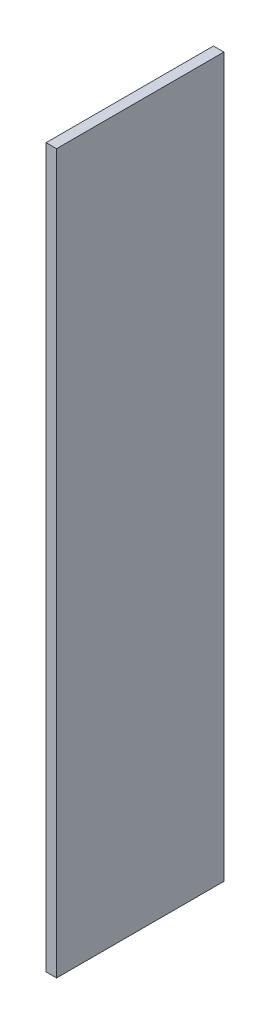
ISO-10303-21;
HEADER;
FILE_DESCRIPTION(('STEP AP214'),'2;1');
FILE_NAME('part.step','',(''),(''),'','','');
FILE_SCHEMA(('AUTOMOTIVE_DESIGN { 1 0 10303 214 1 1 1 1 }'));
ENDSEC;
DATA;
#1=APPLICATION_CONTEXT('core data for automotive mechanical design processes');
#2=APPLICATION_PROTOCOL_DEFINITION('international standard','automotive_design',2000,#1);
#3=PRODUCT_CONTEXT('',#1,'mechanical');
#4=PRODUCT('Part','Part','',(#3));
#5=PRODUCT_RELATED_PRODUCT_CATEGORY('part','',(#4));
#6=PRODUCT_DEFINITION_FORMATION('','',#4);
#7=PRODUCT_DEFINITION_CONTEXT('part definition',#1,'design');
#8=PRODUCT_DEFINITION('design','',#6,#7);
#9=PRODUCT_DEFINITION_SHAPE('','',#8);
#10=(LENGTH_UNIT() NAMED_UNIT(*) SI_UNIT(.MILLI.,.METRE.));
#11=(NAMED_UNIT(*) PLANE_ANGLE_UNIT() SI_UNIT($,.RADIAN.));
#12=(NAMED_UNIT(*) SI_UNIT($,.STERADIAN.) SOLID_ANGLE_UNIT());
#13=UNCERTAINTY_MEASURE_WITH_UNIT(LENGTH_MEASURE(1.E-05),#10,'distance_accuracy_value','');
#14=(GEOMETRIC_REPRESENTATION_CONTEXT(3) GLOBAL_UNCERTAINTY_ASSIGNED_CONTEXT((#13)) GLOBAL_UNIT_ASSIGNED_CONTEXT((#10,
#11,#12)) REPRESENTATION_CONTEXT('',''));
#15=CARTESIAN_POINT('',(0.,0.,0.));
#16=DIRECTION('',(0.,0.,1.));
#17=DIRECTION('',(1.,0.,0.));
#18=AXIS2_PLACEMENT_3D('',#15,#16,#17);
#19=CARTESIAN_POINT('',(3.,-103.,-24.));
#20=DIRECTION('',(0.,0.,1.));
#21=DIRECTION('',(1.,0.,0.));
#22=AXIS2_PLACEMENT_3D('',#19,#20,#21);
#23=PLANE('',#22);
#24=DIRECTION('',(0.,1.,0.));
#25=VECTOR('',#24,1.);
#26=CARTESIAN_POINT('',(0.,-103.,-24.));
#27=LINE('',#26,#25);
#28=CARTESIAN_POINT('',(0.,-103.,-24.));
#29=VERTEX_POINT('',#28);
#30=CARTESIAN_POINT('',(0.,103.,-24.));
#31=VERTEX_POINT('',#30);
#32=EDGE_CURVE('E107',#29,#31,#27,.T.);
#33=ORIENTED_EDGE('',*,*,#32,.T.);
#34=DIRECTION('',(-1.,0.,0.));
#35=VECTOR('',#34,1.);
#36=CARTESIAN_POINT('',(3.,103.,-24.));
#37=LINE('',#36,#35);
#38=CARTESIAN_POINT('',(3.,103.,-24.));
#39=VERTEX_POINT('',#38);
#40=EDGE_CURVE('E11',#39,#31,#37,.T.);
#41=ORIENTED_EDGE('',*,*,#40,.F.);
#42=DIRECTION('',(0.,1.,0.));
#43=VECTOR('',#42,1.);
#44=CARTESIAN_POINT('',(3.,-103.,-24.));
#45=LINE('',#44,#43);
#46=CARTESIAN_POINT('',(3.,-103.,-24.));
#47=VERTEX_POINT('',#46);
#48=EDGE_CURVE('E91',#47,#39,#45,.T.);
#49=ORIENTED_EDGE('',*,*,#48,.F.);
#50=DIRECTION('',(-1.,0.,0.));
#51=VECTOR('',#50,1.);
#52=CARTESIAN_POINT('',(3.,-103.,-24.));
#53=LINE('',#52,#51);
#54=EDGE_CURVE('E103',#47,#29,#53,.T.);
#55=ORIENTED_EDGE('',*,*,#54,.T.);
#56=EDGE_LOOP('',(#33,#41,#49,#55));
#57=FACE_BOUND('',#56,.T.);
#58=ADVANCED_FACE('F39',(#57),#23,.F.);
#59=CARTESIAN_POINT('',(3.,103.,24.));
#60=DIRECTION('',(0.,-1.,0.));
#61=DIRECTION('',(0.,0.,-1.));
#62=AXIS2_PLACEMENT_3D('',#59,#60,#61);
#63=PLANE('',#62);
#64=DIRECTION('',(0.,0.,1.));
#65=VECTOR('',#64,1.);
#66=CARTESIAN_POINT('',(0.,103.,24.));
#67=LINE('',#66,#65);
#68=CARTESIAN_POINT('',(0.,103.,24.));
#69=VERTEX_POINT('',#68);
#70=EDGE_CURVE('E96',#31,#69,#67,.T.);
#71=ORIENTED_EDGE('',*,*,#70,.T.);
#72=DIRECTION('',(-1.,0.,0.));
#73=VECTOR('',#72,1.);
#74=CARTESIAN_POINT('',(3.,103.,24.));
#75=LINE('',#74,#73);
#76=CARTESIAN_POINT('',(3.,103.,24.));
#77=VERTEX_POINT('',#76);
#78=EDGE_CURVE('E48',#77,#69,#75,.T.);
#79=ORIENTED_EDGE('',*,*,#78,.F.);
#80=DIRECTION('',(0.,0.,1.));
#81=VECTOR('',#80,1.);
#82=CARTESIAN_POINT('',(3.,103.,24.));
#83=LINE('',#82,#81);
#84=EDGE_CURVE('E86',#39,#77,#83,.T.);
#85=ORIENTED_EDGE('',*,*,#84,.F.);
#86=ORIENTED_EDGE('',*,*,#40,.T.);
#87=EDGE_LOOP('',(#71,#79,#85,#86));
#88=FACE_BOUND('',#87,.T.);
#89=ADVANCED_FACE('F95',(#88),#63,.F.);
#90=CARTESIAN_POINT('',(3.,-103.,24.));
#91=DIRECTION('',(0.,0.,-1.));
#92=DIRECTION('',(-1.,0.,0.));
#93=AXIS2_PLACEMENT_3D('',#90,#91,#92);
#94=PLANE('',#93);
#95=DIRECTION('',(0.,-1.,0.));
#96=VECTOR('',#95,1.);
#97=CARTESIAN_POINT('',(0.,-103.,24.));
#98=LINE('',#97,#96);
#99=CARTESIAN_POINT('',(0.,-103.,24.));
#100=VERTEX_POINT('',#99);
#101=EDGE_CURVE('E73',#69,#100,#98,.T.);
#102=ORIENTED_EDGE('',*,*,#101,.T.);
#103=DIRECTION('',(-1.,0.,0.));
#104=VECTOR('',#103,1.);
#105=CARTESIAN_POINT('',(3.,-103.,24.));
#106=LINE('',#105,#104);
#107=CARTESIAN_POINT('',(3.,-103.,24.));
#108=VERTEX_POINT('',#107);
#109=EDGE_CURVE('E98',#108,#100,#106,.T.);
#110=ORIENTED_EDGE('',*,*,#109,.F.);
#111=DIRECTION('',(0.,-1.,0.));
#112=VECTOR('',#111,1.);
#113=CARTESIAN_POINT('',(3.,-103.,24.));
#114=LINE('',#113,#112);
#115=EDGE_CURVE('E89',#77,#108,#114,.T.);
#116=ORIENTED_EDGE('',*,*,#115,.F.);
#117=ORIENTED_EDGE('',*,*,#78,.T.);
#118=EDGE_LOOP('',(#102,#110,#116,#117));
#119=FACE_BOUND('',#118,.T.);
#120=ADVANCED_FACE('F99',(#119),#94,.F.);
#121=CARTESIAN_POINT('',(3.,-103.,24.));
#122=DIRECTION('',(0.,1.,0.));
#123=DIRECTION('',(0.,0.,1.));
#124=AXIS2_PLACEMENT_3D('',#121,#122,#123);
#125=PLANE('',#124);
#126=DIRECTION('',(0.,0.,-1.));
#127=VECTOR('',#126,1.);
#128=CARTESIAN_POINT('',(0.,-103.,24.));
#129=LINE('',#128,#127);
#130=EDGE_CURVE('E79',#100,#29,#129,.T.);
#131=ORIENTED_EDGE('',*,*,#130,.T.);
#132=ORIENTED_EDGE('',*,*,#54,.F.);
#133=DIRECTION('',(0.,0.,-1.));
#134=VECTOR('',#133,1.);
#135=CARTESIAN_POINT('',(3.,-103.,24.));
#136=LINE('',#135,#134);
#137=EDGE_CURVE('E56',#108,#47,#136,.T.);
#138=ORIENTED_EDGE('',*,*,#137,.F.);
#139=ORIENTED_EDGE('',*,*,#109,.T.);
#140=EDGE_LOOP('',(#131,#132,#138,#139));
#141=FACE_BOUND('',#140,.T.);
#142=ADVANCED_FACE('F120',(#141),#125,.F.);
#143=CARTESIAN_POINT('',(3.,0.,0.));
#144=DIRECTION('',(-1.,0.,0.));
#145=DIRECTION('',(0.,0.,1.));
#146=AXIS2_PLACEMENT_3D('',#143,#144,#145);
#147=PLANE('',#146);
#148=ORIENTED_EDGE('',*,*,#48,.T.);
#149=ORIENTED_EDGE('',*,*,#84,.T.);
#150=ORIENTED_EDGE('',*,*,#115,.T.);
#151=ORIENTED_EDGE('',*,*,#137,.T.);
#152=EDGE_LOOP('',(#148,#149,#150,#151));
#153=FACE_BOUND('',#152,.T.);
#154=ADVANCED_FACE('F87',(#153),#147,.F.);
#155=CARTESIAN_POINT('',(0.,0.,0.));
#156=DIRECTION('',(-1.,0.,0.));
#157=DIRECTION('',(0.,0.,1.));
#158=AXIS2_PLACEMENT_3D('',#155,#156,#157);
#159=PLANE('',#158);
#160=ORIENTED_EDGE('',*,*,#32,.F.);
#161=ORIENTED_EDGE('',*,*,#130,.F.);
#162=ORIENTED_EDGE('',*,*,#101,.F.);
#163=ORIENTED_EDGE('',*,*,#70,.F.);
#164=EDGE_LOOP('',(#160,#161,#162,#163));
#165=FACE_BOUND('',#164,.T.);
#166=ADVANCED_FACE('F123',(#165),#159,.T.);
#167=CLOSED_SHELL('',(#58,#89,#120,#142,#154,#166));
#168=MANIFOLD_SOLID_BREP('B2',#167);
#169=ADVANCED_BREP_SHAPE_REPRESENTATION('',(#18,#168),#14);
#170=SHAPE_DEFINITION_REPRESENTATION(#9,#169);
ENDSEC;
END-ISO-10303-21;
